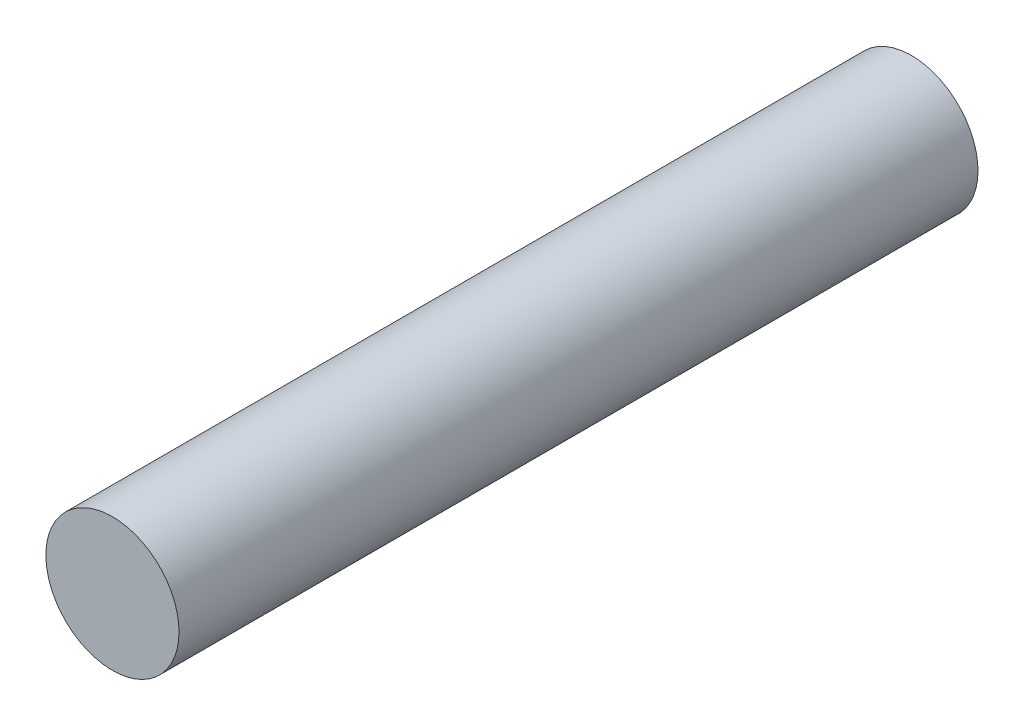
ISO-10303-21;
HEADER;
FILE_DESCRIPTION(('STEP AP214'),'2;1');
FILE_NAME('part.step','',(''),(''),'','','');
FILE_SCHEMA(('AUTOMOTIVE_DESIGN { 1 0 10303 214 1 1 1 1 }'));
ENDSEC;
DATA;
#1=APPLICATION_CONTEXT('core data for automotive mechanical design processes');
#2=APPLICATION_PROTOCOL_DEFINITION('international standard','automotive_design',2000,#1);
#3=PRODUCT_CONTEXT('',#1,'mechanical');
#4=PRODUCT('Part','Part','',(#3));
#5=PRODUCT_RELATED_PRODUCT_CATEGORY('part','',(#4));
#6=PRODUCT_DEFINITION_FORMATION('','',#4);
#7=PRODUCT_DEFINITION_CONTEXT('part definition',#1,'design');
#8=PRODUCT_DEFINITION('design','',#6,#7);
#9=PRODUCT_DEFINITION_SHAPE('','',#8);
#10=(LENGTH_UNIT() NAMED_UNIT(*) SI_UNIT(.MILLI.,.METRE.));
#11=(NAMED_UNIT(*) PLANE_ANGLE_UNIT() SI_UNIT($,.RADIAN.));
#12=(NAMED_UNIT(*) SI_UNIT($,.STERADIAN.) SOLID_ANGLE_UNIT());
#13=UNCERTAINTY_MEASURE_WITH_UNIT(LENGTH_MEASURE(1.E-05),#10,'distance_accuracy_value','');
#14=(GEOMETRIC_REPRESENTATION_CONTEXT(3) GLOBAL_UNCERTAINTY_ASSIGNED_CONTEXT((#13)) GLOBAL_UNIT_ASSIGNED_CONTEXT((#10,
#11,#12)) REPRESENTATION_CONTEXT('',''));
#15=CARTESIAN_POINT('',(0.,0.,0.));
#16=DIRECTION('',(0.,0.,1.));
#17=DIRECTION('',(1.,0.,0.));
#18=AXIS2_PLACEMENT_3D('',#15,#16,#17);
#19=CARTESIAN_POINT('',(0.,0.,1.5));
#20=DIRECTION('',(0.,0.,-1.));
#21=DIRECTION('',(-1.,0.,0.));
#22=AXIS2_PLACEMENT_3D('',#19,#20,#21);
#23=CYLINDRICAL_SURFACE('',#22,0.125);
#24=CARTESIAN_POINT('',(0.,0.,1.5));
#25=DIRECTION('',(0.,0.,1.));
#26=DIRECTION('',(1.,0.,0.));
#27=AXIS2_PLACEMENT_3D('',#24,#25,#26);
#28=CIRCLE('',#27,0.125);
#29=CARTESIAN_POINT('',(0.125,0.,1.5));
#30=VERTEX_POINT('',#29);
#31=EDGE_CURVE('E10',#30,#30,#28,.T.);
#32=ORIENTED_EDGE('',*,*,#31,.F.);
#33=EDGE_LOOP('',(#32));
#34=FACE_BOUND('',#33,.T.);
#35=CARTESIAN_POINT('',(0.,0.,0.));
#36=DIRECTION('',(0.,0.,1.));
#37=DIRECTION('',(1.,0.,0.));
#38=AXIS2_PLACEMENT_3D('',#35,#36,#37);
#39=CIRCLE('',#38,0.125);
#40=CARTESIAN_POINT('',(0.125,0.,0.));
#41=VERTEX_POINT('',#40);
#42=EDGE_CURVE('E37',#41,#41,#39,.T.);
#43=ORIENTED_EDGE('',*,*,#42,.T.);
#44=EDGE_LOOP('',(#43));
#45=FACE_BOUND('',#44,.T.);
#46=ADVANCED_FACE('F34',(#34,#45),#23,.T.);
#47=CARTESIAN_POINT('',(0.,0.,1.5));
#48=DIRECTION('',(0.,0.,1.));
#49=DIRECTION('',(1.,0.,0.));
#50=AXIS2_PLACEMENT_3D('',#47,#48,#49);
#51=PLANE('',#50);
#52=ORIENTED_EDGE('',*,*,#31,.T.);
#53=EDGE_LOOP('',(#52));
#54=FACE_BOUND('',#53,.T.);
#55=ADVANCED_FACE('F49',(#54),#51,.T.);
#56=CARTESIAN_POINT('',(0.,0.,0.));
#57=DIRECTION('',(0.,0.,1.));
#58=DIRECTION('',(1.,0.,0.));
#59=AXIS2_PLACEMENT_3D('',#56,#57,#58);
#60=PLANE('',#59);
#61=ORIENTED_EDGE('',*,*,#42,.F.);
#62=EDGE_LOOP('',(#61));
#63=FACE_BOUND('',#62,.T.);
#64=ADVANCED_FACE('F47',(#63),#60,.F.);
#65=CLOSED_SHELL('',(#46,#55,#64));
#66=MANIFOLD_SOLID_BREP('B2',#65);
#67=ADVANCED_BREP_SHAPE_REPRESENTATION('',(#18,#66),#14);
#68=SHAPE_DEFINITION_REPRESENTATION(#9,#67);
ENDSEC;
END-ISO-10303-21;
